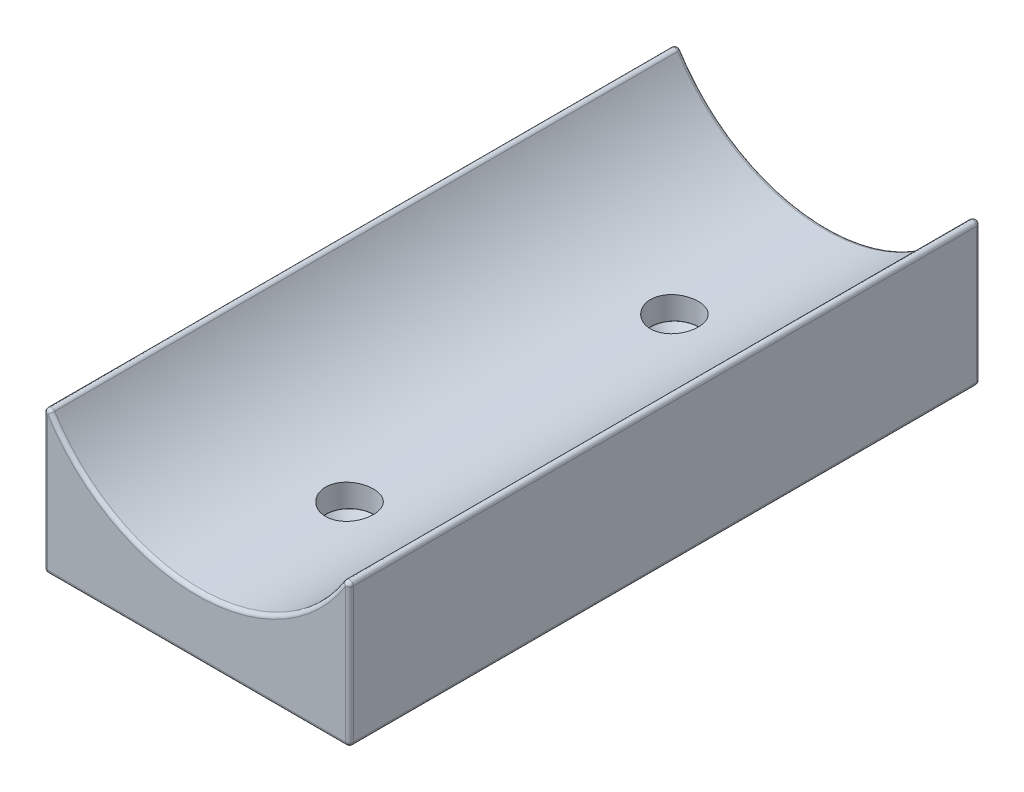
ISO-10303-21;
HEADER;
FILE_DESCRIPTION(('STEP AP214'),'2;1');
FILE_NAME('part.step','',(''),(''),'','','');
FILE_SCHEMA(('AUTOMOTIVE_DESIGN { 1 0 10303 214 1 1 1 1 }'));
ENDSEC;
DATA;
#1=APPLICATION_CONTEXT('core data for automotive mechanical design processes');
#2=APPLICATION_PROTOCOL_DEFINITION('international standard','automotive_design',2000,#1);
#3=PRODUCT_CONTEXT('',#1,'mechanical');
#4=PRODUCT('Part','Part','',(#3));
#5=PRODUCT_RELATED_PRODUCT_CATEGORY('part','',(#4));
#6=PRODUCT_DEFINITION_FORMATION('','',#4);
#7=PRODUCT_DEFINITION_CONTEXT('part definition',#1,'design');
#8=PRODUCT_DEFINITION('design','',#6,#7);
#9=PRODUCT_DEFINITION_SHAPE('','',#8);
#10=(LENGTH_UNIT() NAMED_UNIT(*) SI_UNIT(.MILLI.,.METRE.));
#11=(NAMED_UNIT(*) PLANE_ANGLE_UNIT() SI_UNIT($,.RADIAN.));
#12=(NAMED_UNIT(*) SI_UNIT($,.STERADIAN.) SOLID_ANGLE_UNIT());
#13=UNCERTAINTY_MEASURE_WITH_UNIT(LENGTH_MEASURE(1.E-05),#10,'distance_accuracy_value','');
#14=(GEOMETRIC_REPRESENTATION_CONTEXT(3) GLOBAL_UNCERTAINTY_ASSIGNED_CONTEXT((#13)) GLOBAL_UNIT_ASSIGNED_CONTEXT((#10,
#11,#12)) REPRESENTATION_CONTEXT('',''));
#15=CARTESIAN_POINT('',(0.,0.,0.));
#16=DIRECTION('',(0.,0.,1.));
#17=DIRECTION('',(1.,0.,0.));
#18=AXIS2_PLACEMENT_3D('',#15,#16,#17);
#19=CARTESIAN_POINT('',(20.32,30.861,83.82));
#20=DIRECTION('',(0.,0.,-1.));
#21=DIRECTION('',(-1.,0.,0.));
#22=AXIS2_PLACEMENT_3D('',#19,#20,#21);
#23=CYLINDRICAL_SURFACE('',#22,22.86);
#24=DIRECTION('',(0.,0.,-1.));
#25=VECTOR('',#24,1.);
#26=CARTESIAN_POINT('',(39.7013043478261,18.7389274966309,83.82));
#27=LINE('',#26,#25);
#28=CARTESIAN_POINT('',(39.7013043478261,18.7389274966309,83.312));
#29=VERTEX_POINT('',#28);
#30=CARTESIAN_POINT('',(39.7013043478261,18.7389274966309,0.507999999999995));
#31=VERTEX_POINT('',#30);
#32=EDGE_CURVE('E172',#29,#31,#27,.T.);
#33=ORIENTED_EDGE('',*,*,#32,.T.);
#34=CARTESIAN_POINT('',(20.32,30.861,0.507999999999995));
#35=DIRECTION('',(0.,0.,1.));
#36=DIRECTION('',(1.,0.,0.));
#37=AXIS2_PLACEMENT_3D('',#34,#35,#36);
#38=CIRCLE('',#37,22.86);
#39=CARTESIAN_POINT('',(0.938695652173919,18.7389274966309,0.507999999999995));
#40=VERTEX_POINT('',#39);
#41=EDGE_CURVE('E376',#31,#40,#38,.F.);
#42=ORIENTED_EDGE('',*,*,#41,.T.);
#43=DIRECTION('',(0.,0.,-1.));
#44=VECTOR('',#43,1.);
#45=CARTESIAN_POINT('',(0.938695652173919,18.7389274966309,83.82));
#46=LINE('',#45,#44);
#47=CARTESIAN_POINT('',(0.938695652173919,18.7389274966309,83.312));
#48=VERTEX_POINT('',#47);
#49=EDGE_CURVE('E178',#40,#48,#46,.F.);
#50=ORIENTED_EDGE('',*,*,#49,.T.);
#51=CARTESIAN_POINT('',(20.32,30.861,83.312));
#52=DIRECTION('',(0.,0.,1.));
#53=DIRECTION('',(1.,0.,0.));
#54=AXIS2_PLACEMENT_3D('',#51,#52,#53);
#55=CIRCLE('',#54,22.86);
#56=EDGE_CURVE('E153',#48,#29,#55,.T.);
#57=ORIENTED_EDGE('',*,*,#56,.T.);
#58=EDGE_LOOP('',(#33,#42,#50,#57));
#59=FACE_BOUND('',#58,.T.);
#60=CARTESIAN_POINT('',(20.32,8.001,60.325));
#61=CARTESIAN_POINT('',(20.1425747941006,8.00100268953608,60.3250074259098));
#62=CARTESIAN_POINT('',(19.9650429339173,8.00308732349237,60.339922481686));
#63=CARTESIAN_POINT('',(19.6149311537599,8.01120276633057,60.3991794070121));
#64=CARTESIAN_POINT('',(19.442356400965,8.01723754730456,60.4435508972804));
#65=CARTESIAN_POINT('',(19.1072771624218,8.03257432726405,60.560378039813));
#66=CARTESIAN_POINT('',(18.9447655487206,8.04187398178897,60.6328135435524));
#67=CARTESIAN_POINT('',(18.6342320073907,8.06270978242914,60.8036656254424));
#68=CARTESIAN_POINT('',(18.4862078526872,8.07424558397898,60.9020782016589));
#69=CARTESIAN_POINT('',(18.2078259748383,8.09835538536115,61.1227984753372));
#70=CARTESIAN_POINT('',(18.0775800022721,8.11093521866673,61.24524649486));
#71=CARTESIAN_POINT('',(17.8394150856185,8.13566896522143,61.5102600606394));
#72=CARTESIAN_POINT('',(17.7314973551555,8.14782285528913,61.652826699711));
#73=CARTESIAN_POINT('',(17.54062567205,8.17038548302475,61.9547704146572));
#74=CARTESIAN_POINT('',(17.4577783031403,8.18078668863961,62.1142154782121));
#75=CARTESIAN_POINT('',(17.3200799739782,8.19858773165941,62.444925160577));
#76=CARTESIAN_POINT('',(17.2652277062289,8.20598770923187,62.6161892269622));
#77=CARTESIAN_POINT('',(17.185420366461,8.21689174113152,62.9645066993128));
#78=CARTESIAN_POINT('',(17.1602751070276,8.22042056845701,63.1415157397005));
#79=CARTESIAN_POINT('',(17.1400066949234,8.22325820334618,63.4972735605391));
#80=CARTESIAN_POINT('',(17.1448820603799,8.22256721920746,63.6760222546827));
#81=CARTESIAN_POINT('',(17.1843607594046,8.21706596972832,64.0288503292074));
#82=CARTESIAN_POINT('',(17.2187533619963,8.2122849052783,64.2029538092039));
#83=CARTESIAN_POINT('',(17.3159608839858,8.19918777588387,64.5428943691621));
#84=CARTESIAN_POINT('',(17.3787765017284,8.19087162408376,64.7087312459046));
#85=CARTESIAN_POINT('',(17.5312695276734,8.17160867652345,65.028078550778));
#86=CARTESIAN_POINT('',(17.6210372723077,8.16065305875744,65.1815452880391));
#87=CARTESIAN_POINT('',(17.8248219094465,8.13735216777575,65.4713167625527));
#88=CARTESIAN_POINT('',(17.9388401690861,8.12500681623159,65.6076205315443));
#89=CARTESIAN_POINT('',(18.1890512135839,8.10018806147019,65.8604190927338));
#90=CARTESIAN_POINT('',(18.3254253958391,8.08771446646367,65.976734400518));
#91=CARTESIAN_POINT('',(18.6158559377151,8.06414311288006,66.1848525866876));
#92=CARTESIAN_POINT('',(18.7699123561251,8.05304535887756,66.2766553835713));
#93=CARTESIAN_POINT('',(19.0914818404993,8.03346680801043,66.433147572226));
#94=CARTESIAN_POINT('',(19.2590011315058,8.02498723063021,66.4978243343458));
#95=CARTESIAN_POINT('',(19.602666870342,8.01161099471261,66.5980788230908));
#96=CARTESIAN_POINT('',(19.7788128181881,8.00671412879012,66.6336582340289));
#97=CARTESIAN_POINT('',(20.1331813471256,8.00108228288109,66.6744722061363));
#98=CARTESIAN_POINT('',(20.3113749644631,8.00031342969072,66.6799537496184));
#99=CARTESIAN_POINT('',(20.6661385572871,8.00293238099738,66.6610701915688));
#100=CARTESIAN_POINT('',(20.8427085755579,8.00632007564469,66.6367058788067));
#101=CARTESIAN_POINT('',(21.1884736994443,8.01685048403978,66.5590275227678));
#102=CARTESIAN_POINT('',(21.3576960804246,8.02397774119968,66.5058326142544));
#103=CARTESIAN_POINT('',(21.6848193585933,8.04119013507984,66.3721278794507));
#104=CARTESIAN_POINT('',(21.8427197908676,8.05127539317828,66.2916169322568));
#105=CARTESIAN_POINT('',(22.1438109586694,8.07336576631261,66.104977658936));
#106=CARTESIAN_POINT('',(22.2869028084727,8.08538257053394,65.9986912160543));
#107=CARTESIAN_POINT('',(22.5533055988332,8.10995876277786,65.7637398160434));
#108=CARTESIAN_POINT('',(22.676615560809,8.12251817760364,65.6350737524823));
#109=CARTESIAN_POINT('',(22.9008425473245,8.14687014200974,65.3579212353099));
#110=CARTESIAN_POINT('',(23.0015948521119,8.15865663275617,65.2093009053861));
#111=CARTESIAN_POINT('',(23.1767048659207,8.18002444645374,64.8971015529824));
#112=CARTESIAN_POINT('',(23.2510632052712,8.18960582206456,64.7335228878483));
#113=CARTESIAN_POINT('',(23.3710138915062,8.20543582550541,64.3965601937068));
#114=CARTESIAN_POINT('',(23.4166957984001,8.21169481998703,64.2232085540887));
#115=CARTESIAN_POINT('',(23.4782835881875,8.22019993678631,63.8712012749253));
#116=CARTESIAN_POINT('',(23.4941912109621,8.22244629358491,63.6925459459247));
#117=CARTESIAN_POINT('',(23.4957418852833,8.22266390899993,63.3366429188915));
#118=CARTESIAN_POINT('',(23.4816438123692,8.22067173578499,63.1593963161951));
#119=CARTESIAN_POINT('',(23.4241349864193,8.21271583127374,62.8098194946265));
#120=CARTESIAN_POINT('',(23.3807242551586,8.20675210292773,62.6374892721024));
#121=CARTESIAN_POINT('',(23.2659090773695,8.19153714830777,62.3026913146456));
#122=CARTESIAN_POINT('',(23.1945201268565,8.1822877421042,62.1402181776933));
#123=CARTESIAN_POINT('',(23.0258004736194,8.16154105147753,61.8295141780129));
#124=CARTESIAN_POINT('',(22.9284691478571,8.15004371306932,61.6812836574551));
#125=CARTESIAN_POINT('',(22.709677467455,8.12597812965722,61.4019533242216));
#126=CARTESIAN_POINT('',(22.5880247347735,8.11340183463075,61.2710048750835));
#127=CARTESIAN_POINT('',(22.3244488712294,8.08866440806861,61.0312861847971));
#128=CARTESIAN_POINT('',(22.1825210071528,8.07650337429905,60.9225211367811));
#129=CARTESIAN_POINT('',(21.8816477323371,8.05390234815407,60.7298093490144));
#130=CARTESIAN_POINT('',(21.7226256006919,8.04347069852305,60.6459814497308));
#131=CARTESIAN_POINT('',(21.3926963537488,8.02558655441955,60.506345395131));
#132=CARTESIAN_POINT('',(21.2218020511703,8.0181309050639,60.4505075511631));
#133=CARTESIAN_POINT('',(20.9284036924127,8.00878546287739,60.3814319389698));
#134=CARTESIAN_POINT('',(20.8077299571767,8.00588054583892,60.3603013924478));
#135=CARTESIAN_POINT('',(20.5647210526457,8.0019868962886,60.3320829313859));
#136=CARTESIAN_POINT('',(20.4423858998267,8.00099814478844,60.3249948776914));
#137=CARTESIAN_POINT('',(20.32,8.001,60.325));
#138=B_SPLINE_CURVE_WITH_KNOTS('',3,(#60,#61,#62,#63,#64,#65,#66,#67,#68,#69,#70,#71,#72,#73,
#74,#75,#76,#77,#78,#79,#80,#81,#82,#83,#84,#85,#86,#87,#88,#89,#90,#91,#92,#93,#94,#95,#96,#97,
#98,#99,#100,#101,#102,#103,#104,#105,#106,#107,#108,#109,#110,#111,#112,#113,#114,#115,#116,
#117,#118,#119,#120,#121,#122,#123,#124,#125,#126,#127,#128,#129,#130,#131,#132,#133,#134,#135,
#136,#137),.UNSPECIFIED.,.T.,.F.,(4,2,2,2,2,2,2,2,2,2,2,2,2,2,2,2,2,2,2,2,2,2,2,2,2,2,2,2,2,2,2,
2,2,2,2,2,2,2,4),(0.,0.531828489450308,1.06419258521344,1.59617517697053,2.12807586118937,
2.66317952302756,3.19831226213564,3.73568908761417,4.27304081288614,4.80693338479768,
5.34079960301054,5.87088582304589,6.40098506784442,6.93288128583015,7.46480749768517,
8.00128536683961,8.53776501970691,9.07449417639823,9.61119226208588,10.1434795607122,
10.6757527922935,11.2058431320073,11.7359552264128,12.2694053624824,12.8028818794307,
13.3401353365429,13.8773759623408,14.4129302612793,14.9484532637514,15.4793747546888,
16.0102958512276,16.5409233064515,17.0715635064973,17.6065800314278,18.1417216602855,
18.679374142954,19.2164551321858,19.5833080430183,19.9501573184913),.UNSPECIFIED.);
#139=CARTESIAN_POINT('',(20.32,8.001,60.325));
#140=VERTEX_POINT('',#139);
#141=EDGE_CURVE('E182',#140,#140,#138,.T.);
#142=ORIENTED_EDGE('',*,*,#141,.F.);
#143=EDGE_LOOP('',(#142));
#144=FACE_BOUND('',#143,.T.);
#145=CARTESIAN_POINT('',(20.32,8.001,17.145));
#146=CARTESIAN_POINT('',(20.1425747941006,8.00100268953608,17.1450074259099));
#147=CARTESIAN_POINT('',(19.9650429339173,8.00308732349237,17.159922481686));
#148=CARTESIAN_POINT('',(19.6149311537599,8.01120276633057,17.2191794070121));
#149=CARTESIAN_POINT('',(19.442356400965,8.01723754730456,17.2635508972804));
#150=CARTESIAN_POINT('',(19.1072771624218,8.03257432726405,17.380378039813));
#151=CARTESIAN_POINT('',(18.9447655487206,8.04187398178897,17.4528135435524));
#152=CARTESIAN_POINT('',(18.6342320073907,8.06270978242914,17.6236656254424));
#153=CARTESIAN_POINT('',(18.4862078526872,8.07424558397898,17.7220782016589));
#154=CARTESIAN_POINT('',(18.2078259748383,8.09835538536115,17.9427984753372));
#155=CARTESIAN_POINT('',(18.0775800022721,8.11093521866673,18.06524649486));
#156=CARTESIAN_POINT('',(17.8394150856185,8.13566896522143,18.3302600606394));
#157=CARTESIAN_POINT('',(17.7314973551555,8.14782285528913,18.472826699711));
#158=CARTESIAN_POINT('',(17.54062567205,8.17038548302475,18.7747704146572));
#159=CARTESIAN_POINT('',(17.4577783031403,8.18078668863961,18.9342154782121));
#160=CARTESIAN_POINT('',(17.3200799739782,8.19858773165942,19.264925160577));
#161=CARTESIAN_POINT('',(17.2652277062289,8.20598770923187,19.4361892269622));
#162=CARTESIAN_POINT('',(17.185420366461,8.21689174113151,19.7845066993129));
#163=CARTESIAN_POINT('',(17.1602751070276,8.220420568457,19.9615157397006));
#164=CARTESIAN_POINT('',(17.1400066949234,8.22325820334618,20.3172735605391));
#165=CARTESIAN_POINT('',(17.1448820603799,8.22256721920746,20.4960222546827));
#166=CARTESIAN_POINT('',(17.1843607594046,8.21706596972833,20.8488503292074));
#167=CARTESIAN_POINT('',(17.2187533619963,8.2122849052783,21.0229538092039));
#168=CARTESIAN_POINT('',(17.3159608839858,8.19918777588387,21.3628943691621));
#169=CARTESIAN_POINT('',(17.3787765017284,8.19087162408376,21.5287312459047));
#170=CARTESIAN_POINT('',(17.5312695276734,8.17160867652345,21.8480785507781));
#171=CARTESIAN_POINT('',(17.6210372723077,8.16065305875745,22.0015452880391));
#172=CARTESIAN_POINT('',(17.8248219094465,8.13735216777574,22.2913167625528));
#173=CARTESIAN_POINT('',(17.9388401690861,8.12500681623158,22.4276205315443));
#174=CARTESIAN_POINT('',(18.1890512135838,8.10018806147019,22.6804190927338));
#175=CARTESIAN_POINT('',(18.3254253958391,8.08771446646367,22.796734400518));
#176=CARTESIAN_POINT('',(18.6158559377151,8.06414311288006,23.0048525866876));
#177=CARTESIAN_POINT('',(18.7699123561251,8.05304535887756,23.0966553835713));
#178=CARTESIAN_POINT('',(19.0914818404993,8.03346680801043,23.253147572226));
#179=CARTESIAN_POINT('',(19.2590011315058,8.02498723063021,23.3178243343458));
#180=CARTESIAN_POINT('',(19.602666870342,8.01161099471261,23.4180788230908));
#181=CARTESIAN_POINT('',(19.7788128181881,8.00671412879013,23.453658234029));
#182=CARTESIAN_POINT('',(20.1331813471256,8.00108228288109,23.4944722061363));
#183=CARTESIAN_POINT('',(20.3113749644631,8.00031342969072,23.4999537496184));
#184=CARTESIAN_POINT('',(20.6661385572871,8.00293238099737,23.4810701915688));
#185=CARTESIAN_POINT('',(20.8427085755579,8.0063200756447,23.4567058788067));
#186=CARTESIAN_POINT('',(21.1884736994443,8.01685048403979,23.3790275227678));
#187=CARTESIAN_POINT('',(21.3576960804246,8.02397774119967,23.3258326142544));
#188=CARTESIAN_POINT('',(21.6848193585933,8.04119013507984,23.1921278794507));
#189=CARTESIAN_POINT('',(21.8427197908676,8.05127539317828,23.1116169322568));
#190=CARTESIAN_POINT('',(22.1438109586694,8.07336576631261,22.924977658936));
#191=CARTESIAN_POINT('',(22.2869028084727,8.08538257053394,22.8186912160544));
#192=CARTESIAN_POINT('',(22.5533055988332,8.10995876277786,22.5837398160434));
#193=CARTESIAN_POINT('',(22.676615560809,8.12251817760364,22.4550737524823));
#194=CARTESIAN_POINT('',(22.9008425473245,8.14687014200973,22.17792123531));
#195=CARTESIAN_POINT('',(23.0015948521119,8.15865663275616,22.0293009053861));
#196=CARTESIAN_POINT('',(23.1767048659207,8.18002444645375,21.7171015529824));
#197=CARTESIAN_POINT('',(23.2510632052712,8.18960582206457,21.5535228878483));
#198=CARTESIAN_POINT('',(23.3710138915062,8.20543582550541,21.2165601937068));
#199=CARTESIAN_POINT('',(23.4166957984001,8.21169481998703,21.0432085540887));
#200=CARTESIAN_POINT('',(23.4782835881875,8.22019993678631,20.6912012749253));
#201=CARTESIAN_POINT('',(23.4941912109621,8.22244629358491,20.5125459459247));
#202=CARTESIAN_POINT('',(23.4957418852833,8.22266390899993,20.1566429188915));
#203=CARTESIAN_POINT('',(23.4816438123692,8.22067173578499,19.9793963161951));
#204=CARTESIAN_POINT('',(23.4241349864193,8.21271583127374,19.6298194946265));
#205=CARTESIAN_POINT('',(23.3807242551586,8.20675210292773,19.4574892721024));
#206=CARTESIAN_POINT('',(23.2659090773695,8.19153714830777,19.1226913146456));
#207=CARTESIAN_POINT('',(23.1945201268565,8.1822877421042,18.9602181776933));
#208=CARTESIAN_POINT('',(23.0258004736194,8.16154105147753,18.6495141780129));
#209=CARTESIAN_POINT('',(22.9284691478571,8.15004371306932,18.5012836574551));
#210=CARTESIAN_POINT('',(22.709677467455,8.12597812965722,18.2219533242216));
#211=CARTESIAN_POINT('',(22.5880247347735,8.11340183463075,18.0910048750835));
#212=CARTESIAN_POINT('',(22.3244488712294,8.08866440806861,17.8512861847971));
#213=CARTESIAN_POINT('',(22.1825210071528,8.07650337429905,17.7425211367811));
#214=CARTESIAN_POINT('',(21.8816477323371,8.05390234815407,17.5498093490144));
#215=CARTESIAN_POINT('',(21.7226256006919,8.04347069852305,17.4659814497308));
#216=CARTESIAN_POINT('',(21.3926963537488,8.02558655441955,17.326345395131));
#217=CARTESIAN_POINT('',(21.2218020511703,8.0181309050639,17.2705075511631));
#218=CARTESIAN_POINT('',(20.9284036924127,8.00878546287739,17.2014319389698));
#219=CARTESIAN_POINT('',(20.8077299571767,8.00588054583892,17.1803013924478));
#220=CARTESIAN_POINT('',(20.5647210526457,8.0019868962886,17.1520829313859));
#221=CARTESIAN_POINT('',(20.4423858998267,8.00099814478844,17.1449948776914));
#222=CARTESIAN_POINT('',(20.32,8.001,17.145));
#223=B_SPLINE_CURVE_WITH_KNOTS('',3,(#145,#146,#147,#148,#149,#150,#151,#152,#153,#154,#155,
#156,#157,#158,#159,#160,#161,#162,#163,#164,#165,#166,#167,#168,#169,#170,#171,#172,#173,#174,
#175,#176,#177,#178,#179,#180,#181,#182,#183,#184,#185,#186,#187,#188,#189,#190,#191,#192,#193,
#194,#195,#196,#197,#198,#199,#200,#201,#202,#203,#204,#205,#206,#207,#208,#209,#210,#211,#212,
#213,#214,#215,#216,#217,#218,#219,#220,#221,#222),.UNSPECIFIED.,.T.,.F.,(4,2,2,2,2,2,2,2,2,2,2,
2,2,2,2,2,2,2,2,2,2,2,2,2,2,2,2,2,2,2,2,2,2,2,2,2,2,2,4),(0.,0.531828489450308,1.06419258521344,
1.59617517697053,2.12807586118937,2.66317952302755,3.19831226213564,3.73568908761417,
4.27304081288614,4.80693338479769,5.34079960301054,5.8708858230459,6.40098506784443,
6.93288128583015,7.46480749768518,8.00128536683961,8.53776501970692,9.07449417639824,
9.61119226208589,10.1434795607122,10.6757527922936,11.2058431320073,11.7359552264128,
12.2694053624825,12.8028818794307,13.3401353365429,13.8773759623408,14.4129302612794,
14.9484532637515,15.4793747546889,16.0102958512276,16.5409233064515,17.0715635064973,
17.6065800314278,18.1417216602855,18.679374142954,19.2164551321859,19.5833080430183,
19.9501573184913),.UNSPECIFIED.);
#224=CARTESIAN_POINT('',(20.32,8.001,17.145));
#225=VERTEX_POINT('',#224);
#226=EDGE_CURVE('E191',#225,#225,#223,.T.);
#227=ORIENTED_EDGE('',*,*,#226,.F.);
#228=EDGE_LOOP('',(#227));
#229=FACE_BOUND('',#228,.T.);
#230=ADVANCED_FACE('F41',(#59,#144,#229),#23,.F.);
#231=CARTESIAN_POINT('',(0.,0.,83.82));
#232=DIRECTION('',(1.,0.,0.));
#233=DIRECTION('',(0.,0.,-1.));
#234=AXIS2_PLACEMENT_3D('',#231,#232,#233);
#235=PLANE('',#234);
#236=DIRECTION('',(0.,0.,-1.));
#237=VECTOR('',#236,1.);
#238=CARTESIAN_POINT('',(0.,0.508,83.82));
#239=LINE('',#238,#237);
#240=CARTESIAN_POINT('',(0.,0.508,0.507999999999995));
#241=VERTEX_POINT('',#240);
#242=CARTESIAN_POINT('',(0.,0.508,83.312));
#243=VERTEX_POINT('',#242);
#244=EDGE_CURVE('E354',#241,#243,#239,.F.);
#245=ORIENTED_EDGE('',*,*,#244,.T.);
#246=DIRECTION('',(0.,-1.,0.));
#247=VECTOR('',#246,1.);
#248=CARTESIAN_POINT('',(0.,18.4695481076671,83.312));
#249=LINE('',#248,#247);
#250=CARTESIAN_POINT('',(0.,18.4695481076671,83.312));
#251=VERTEX_POINT('',#250);
#252=EDGE_CURVE('E348',#243,#251,#249,.F.);
#253=ORIENTED_EDGE('',*,*,#252,.T.);
#254=DIRECTION('',(0.,0.,-1.));
#255=VECTOR('',#254,1.);
#256=CARTESIAN_POINT('',(0.,18.4695481076671,83.82));
#257=LINE('',#256,#255);
#258=CARTESIAN_POINT('',(0.,18.4695481076671,0.507999999999995));
#259=VERTEX_POINT('',#258);
#260=EDGE_CURVE('E171',#251,#259,#257,.T.);
#261=ORIENTED_EDGE('',*,*,#260,.T.);
#262=DIRECTION('',(0.,-1.,0.));
#263=VECTOR('',#262,1.);
#264=CARTESIAN_POINT('',(0.,0.,0.507999999999995));
#265=LINE('',#264,#263);
#266=EDGE_CURVE('E351',#259,#241,#265,.T.);
#267=ORIENTED_EDGE('',*,*,#266,.T.);
#268=EDGE_LOOP('',(#245,#253,#261,#267));
#269=FACE_BOUND('',#268,.T.);
#270=ADVANCED_FACE('F220',(#269),#235,.F.);
#271=CARTESIAN_POINT('',(0.,0.,83.82));
#272=DIRECTION('',(0.,1.,0.));
#273=DIRECTION('',(0.,0.,1.));
#274=AXIS2_PLACEMENT_3D('',#271,#272,#273);
#275=PLANE('',#274);
#276=DIRECTION('',(0.,0.,-1.));
#277=VECTOR('',#276,1.);
#278=CARTESIAN_POINT('',(0.508,0.,83.82));
#279=LINE('',#278,#277);
#280=CARTESIAN_POINT('',(0.508,0.,83.312));
#281=VERTEX_POINT('',#280);
#282=CARTESIAN_POINT('',(0.508,0.,0.507999999999995));
#283=VERTEX_POINT('',#282);
#284=EDGE_CURVE('E51',#281,#283,#279,.T.);
#285=ORIENTED_EDGE('',*,*,#284,.T.);
#286=DIRECTION('',(1.,0.,0.));
#287=VECTOR('',#286,1.);
#288=CARTESIAN_POINT('',(0.,0.,0.507999999999995));
#289=LINE('',#288,#287);
#290=CARTESIAN_POINT('',(40.132,0.,0.507999999999995));
#291=VERTEX_POINT('',#290);
#292=EDGE_CURVE('E11',#283,#291,#289,.T.);
#293=ORIENTED_EDGE('',*,*,#292,.T.);
#294=DIRECTION('',(0.,0.,-1.));
#295=VECTOR('',#294,1.);
#296=CARTESIAN_POINT('',(40.132,0.,83.82));
#297=LINE('',#296,#295);
#298=CARTESIAN_POINT('',(40.132,0.,83.312));
#299=VERTEX_POINT('',#298);
#300=EDGE_CURVE('E345',#291,#299,#297,.F.);
#301=ORIENTED_EDGE('',*,*,#300,.T.);
#302=DIRECTION('',(1.,0.,0.));
#303=VECTOR('',#302,1.);
#304=CARTESIAN_POINT('',(0.,0.,83.312));
#305=LINE('',#304,#303);
#306=EDGE_CURVE('E62',#299,#281,#305,.F.);
#307=ORIENTED_EDGE('',*,*,#306,.T.);
#308=EDGE_LOOP('',(#285,#293,#301,#307));
#309=FACE_BOUND('',#308,.T.);
#310=CARTESIAN_POINT('',(20.32,0.,20.32));
#311=DIRECTION('',(0.,1.,0.));
#312=DIRECTION('',(0.,0.,1.));
#313=AXIS2_PLACEMENT_3D('',#310,#311,#312);
#314=CIRCLE('',#313,1.79999999999992);
#315=CARTESIAN_POINT('',(20.32,0.,22.1199999999999));
#316=VERTEX_POINT('',#315);
#317=EDGE_CURVE('E257',#316,#316,#314,.T.);
#318=ORIENTED_EDGE('',*,*,#317,.T.);
#319=EDGE_LOOP('',(#318));
#320=FACE_BOUND('',#319,.T.);
#321=CARTESIAN_POINT('',(20.32,0.,63.5));
#322=DIRECTION('',(0.,1.,0.));
#323=DIRECTION('',(0.,0.,1.));
#324=AXIS2_PLACEMENT_3D('',#321,#322,#323);
#325=CIRCLE('',#324,1.79999999999992);
#326=CARTESIAN_POINT('',(20.32,0.,65.2999999999999));
#327=VERTEX_POINT('',#326);
#328=EDGE_CURVE('E245',#327,#327,#325,.T.);
#329=ORIENTED_EDGE('',*,*,#328,.T.);
#330=EDGE_LOOP('',(#329));
#331=FACE_BOUND('',#330,.T.);
#332=ADVANCED_FACE('F225',(#309,#320,#331),#275,.F.);
#333=CARTESIAN_POINT('',(40.64,0.,83.82));
#334=DIRECTION('',(-1.,0.,0.));
#335=DIRECTION('',(0.,0.,1.));
#336=AXIS2_PLACEMENT_3D('',#333,#334,#335);
#337=PLANE('',#336);
#338=DIRECTION('',(0.,0.,-1.));
#339=VECTOR('',#338,1.);
#340=CARTESIAN_POINT('',(40.64,0.508,83.82));
#341=LINE('',#340,#339);
#342=CARTESIAN_POINT('',(40.64,0.508,83.312));
#343=VERTEX_POINT('',#342);
#344=CARTESIAN_POINT('',(40.64,0.508,0.507999999999995));
#345=VERTEX_POINT('',#344);
#346=EDGE_CURVE('E162',#343,#345,#341,.T.);
#347=ORIENTED_EDGE('',*,*,#346,.T.);
#348=DIRECTION('',(0.,1.,0.));
#349=VECTOR('',#348,1.);
#350=CARTESIAN_POINT('',(40.64,0.,0.507999999999995));
#351=LINE('',#350,#349);
#352=CARTESIAN_POINT('',(40.64,18.4695481076671,0.507999999999995));
#353=VERTEX_POINT('',#352);
#354=EDGE_CURVE('E136',#345,#353,#351,.T.);
#355=ORIENTED_EDGE('',*,*,#354,.T.);
#356=DIRECTION('',(0.,0.,-1.));
#357=VECTOR('',#356,1.);
#358=CARTESIAN_POINT('',(40.64,18.4695481076671,83.82));
#359=LINE('',#358,#357);
#360=CARTESIAN_POINT('',(40.64,18.4695481076671,83.312));
#361=VERTEX_POINT('',#360);
#362=EDGE_CURVE('E159',#353,#361,#359,.F.);
#363=ORIENTED_EDGE('',*,*,#362,.T.);
#364=DIRECTION('',(0.,1.,0.));
#365=VECTOR('',#364,1.);
#366=CARTESIAN_POINT('',(40.64,0.,83.312));
#367=LINE('',#366,#365);
#368=EDGE_CURVE('E166',#361,#343,#367,.F.);
#369=ORIENTED_EDGE('',*,*,#368,.T.);
#370=EDGE_LOOP('',(#347,#355,#363,#369));
#371=FACE_BOUND('',#370,.T.);
#372=ADVANCED_FACE('F158',(#371),#337,.F.);
#373=CARTESIAN_POINT('',(20.32,30.861,83.82));
#374=DIRECTION('',(0.,0.,1.));
#375=DIRECTION('',(1.,0.,0.));
#376=AXIS2_PLACEMENT_3D('',#373,#374,#375);
#377=PLANE('',#376);
#378=DIRECTION('',(0.,-1.,0.));
#379=VECTOR('',#378,1.);
#380=CARTESIAN_POINT('',(0.508000000000002,0.,83.82));
#381=LINE('',#380,#379);
#382=CARTESIAN_POINT('',(0.508000000000002,18.4695481076671,83.82));
#383=VERTEX_POINT('',#382);
#384=CARTESIAN_POINT('',(0.508000000000002,0.508000000000002,83.82));
#385=VERTEX_POINT('',#384);
#386=EDGE_CURVE('E364',#383,#385,#381,.T.);
#387=ORIENTED_EDGE('',*,*,#386,.T.);
#388=DIRECTION('',(1.,0.,0.));
#389=VECTOR('',#388,1.);
#390=CARTESIAN_POINT('',(40.64,0.508000000000002,83.82));
#391=LINE('',#390,#389);
#392=CARTESIAN_POINT('',(40.132,0.508000000000002,83.82));
#393=VERTEX_POINT('',#392);
#394=EDGE_CURVE('E357',#385,#393,#391,.T.);
#395=ORIENTED_EDGE('',*,*,#394,.T.);
#396=DIRECTION('',(0.,1.,0.));
#397=VECTOR('',#396,1.);
#398=CARTESIAN_POINT('',(40.132,18.4695481076671,83.82));
#399=LINE('',#398,#397);
#400=CARTESIAN_POINT('',(40.132,18.4695481076671,83.82));
#401=VERTEX_POINT('',#400);
#402=EDGE_CURVE('E360',#393,#401,#399,.T.);
#403=ORIENTED_EDGE('',*,*,#402,.T.);
#404=CARTESIAN_POINT('',(20.32,30.861,83.82));
#405=DIRECTION('',(0.,0.,1.));
#406=DIRECTION('',(1.,0.,0.));
#407=AXIS2_PLACEMENT_3D('',#404,#405,#406);
#408=CIRCLE('',#407,23.368);
#409=EDGE_CURVE('E367',#401,#383,#408,.F.);
#410=ORIENTED_EDGE('',*,*,#409,.T.);
#411=EDGE_LOOP('',(#387,#395,#403,#410));
#412=FACE_BOUND('',#411,.T.);
#413=ADVANCED_FACE('F209',(#412),#377,.T.);
#414=CARTESIAN_POINT('',(20.32,30.861,0.));
#415=DIRECTION('',(0.,0.,1.));
#416=DIRECTION('',(1.,0.,0.));
#417=AXIS2_PLACEMENT_3D('',#414,#415,#416);
#418=PLANE('',#417);
#419=CARTESIAN_POINT('',(20.32,30.861,0.));
#420=DIRECTION('',(0.,0.,1.));
#421=DIRECTION('',(1.,0.,0.));
#422=AXIS2_PLACEMENT_3D('',#419,#420,#421);
#423=CIRCLE('',#422,23.368);
#424=CARTESIAN_POINT('',(0.508,18.4695481076671,0.));
#425=VERTEX_POINT('',#424);
#426=CARTESIAN_POINT('',(40.132,18.4695481076671,0.));
#427=VERTEX_POINT('',#426);
#428=EDGE_CURVE('E385',#425,#427,#423,.T.);
#429=ORIENTED_EDGE('',*,*,#428,.T.);
#430=DIRECTION('',(0.,1.,0.));
#431=VECTOR('',#430,1.);
#432=CARTESIAN_POINT('',(40.132,30.861,0.));
#433=LINE('',#432,#431);
#434=CARTESIAN_POINT('',(40.132,0.508,0.));
#435=VERTEX_POINT('',#434);
#436=EDGE_CURVE('E138',#427,#435,#433,.F.);
#437=ORIENTED_EDGE('',*,*,#436,.T.);
#438=DIRECTION('',(1.,0.,0.));
#439=VECTOR('',#438,1.);
#440=CARTESIAN_POINT('',(20.32,0.508000000000002,0.));
#441=LINE('',#440,#439);
#442=CARTESIAN_POINT('',(0.508,0.508,0.));
#443=VERTEX_POINT('',#442);
#444=EDGE_CURVE('E388',#435,#443,#441,.F.);
#445=ORIENTED_EDGE('',*,*,#444,.T.);
#446=DIRECTION('',(0.,-1.,0.));
#447=VECTOR('',#446,1.);
#448=CARTESIAN_POINT('',(0.508000000000002,30.861,0.));
#449=LINE('',#448,#447);
#450=EDGE_CURVE('E165',#443,#425,#449,.F.);
#451=ORIENTED_EDGE('',*,*,#450,.T.);
#452=EDGE_LOOP('',(#429,#437,#445,#451));
#453=FACE_BOUND('',#452,.T.);
#454=ADVANCED_FACE('F211',(#453),#418,.F.);
#455=CARTESIAN_POINT('',(40.132,18.4695481076671,83.82));
#456=DIRECTION('',(0.,0.,-1.));
#457=DIRECTION('',(-1.,0.,0.));
#458=AXIS2_PLACEMENT_3D('',#455,#456,#457);
#459=CYLINDRICAL_SURFACE('',#458,0.508);
#460=ORIENTED_EDGE('',*,*,#362,.F.);
#461=CARTESIAN_POINT('',(40.132,18.4695481076671,0.507999999999995));
#462=DIRECTION('',(0.,0.,-1.));
#463=DIRECTION('',(-1.,0.,0.));
#464=AXIS2_PLACEMENT_3D('',#461,#462,#463);
#465=CIRCLE('',#464,0.508);
#466=EDGE_CURVE('E144',#353,#31,#465,.F.);
#467=ORIENTED_EDGE('',*,*,#466,.T.);
#468=ORIENTED_EDGE('',*,*,#32,.F.);
#469=CARTESIAN_POINT('',(40.132,18.4695481076671,83.312));
#470=DIRECTION('',(0.,0.,-1.));
#471=DIRECTION('',(-1.,0.,0.));
#472=AXIS2_PLACEMENT_3D('',#469,#470,#471);
#473=CIRCLE('',#472,0.508);
#474=EDGE_CURVE('E154',#29,#361,#473,.T.);
#475=ORIENTED_EDGE('',*,*,#474,.T.);
#476=EDGE_LOOP('',(#460,#467,#468,#475));
#477=FACE_BOUND('',#476,.T.);
#478=ADVANCED_FACE('F168',(#477),#459,.T.);
#479=CARTESIAN_POINT('',(0.508000000000002,18.4695481076671,83.82));
#480=DIRECTION('',(0.,0.,-1.));
#481=DIRECTION('',(-1.,0.,0.));
#482=AXIS2_PLACEMENT_3D('',#479,#480,#481);
#483=CYLINDRICAL_SURFACE('',#482,0.508);
#484=ORIENTED_EDGE('',*,*,#49,.F.);
#485=CARTESIAN_POINT('',(0.508000000000002,18.4695481076671,0.507999999999995));
#486=DIRECTION('',(0.,0.,-1.));
#487=DIRECTION('',(-1.,0.,0.));
#488=AXIS2_PLACEMENT_3D('',#485,#486,#487);
#489=CIRCLE('',#488,0.508);
#490=EDGE_CURVE('E370',#40,#259,#489,.F.);
#491=ORIENTED_EDGE('',*,*,#490,.T.);
#492=ORIENTED_EDGE('',*,*,#260,.F.);
#493=CARTESIAN_POINT('',(0.508000000000002,18.4695481076671,83.312));
#494=DIRECTION('',(0.,0.,-1.));
#495=DIRECTION('',(-1.,0.,0.));
#496=AXIS2_PLACEMENT_3D('',#493,#494,#495);
#497=CIRCLE('',#496,0.508);
#498=EDGE_CURVE('E373',#251,#48,#497,.T.);
#499=ORIENTED_EDGE('',*,*,#498,.T.);
#500=EDGE_LOOP('',(#484,#491,#492,#499));
#501=FACE_BOUND('',#500,.T.);
#502=ADVANCED_FACE('F207',(#501),#483,.T.);
#503=CARTESIAN_POINT('',(20.32,18.9775481076671,63.5));
#504=DIRECTION('',(0.,-1.,0.));
#505=DIRECTION('',(0.,0.,-1.));
#506=AXIS2_PLACEMENT_3D('',#503,#504,#505);
#507=CYLINDRICAL_SURFACE('',#506,3.175);
#508=CARTESIAN_POINT('',(20.32,5.08,63.5));
#509=DIRECTION('',(0.,1.,0.));
#510=DIRECTION('',(0.,0.,1.));
#511=AXIS2_PLACEMENT_3D('',#508,#509,#510);
#512=CIRCLE('',#511,3.175);
#513=CARTESIAN_POINT('',(20.32,5.08,66.675));
#514=VERTEX_POINT('',#513);
#515=EDGE_CURVE('E241',#514,#514,#512,.T.);
#516=ORIENTED_EDGE('',*,*,#515,.F.);
#517=EDGE_LOOP('',(#516));
#518=FACE_BOUND('',#517,.T.);
#519=ORIENTED_EDGE('',*,*,#141,.T.);
#520=EDGE_LOOP('',(#519));
#521=FACE_BOUND('',#520,.T.);
#522=ADVANCED_FACE('F201',(#518,#521),#507,.F.);
#523=CARTESIAN_POINT('',(20.32,5.08,63.5));
#524=DIRECTION('',(0.,1.,0.));
#525=DIRECTION('',(0.,0.,1.));
#526=AXIS2_PLACEMENT_3D('',#523,#524,#525);
#527=PLANE('',#526);
#528=CARTESIAN_POINT('',(20.32,5.08,63.5));
#529=DIRECTION('',(0.,1.,0.));
#530=DIRECTION('',(0.,0.,1.));
#531=AXIS2_PLACEMENT_3D('',#528,#529,#530);
#532=CIRCLE('',#531,3.15);
#533=CARTESIAN_POINT('',(20.32,5.08,66.65));
#534=VERTEX_POINT('',#533);
#535=EDGE_CURVE('E253',#534,#534,#532,.T.);
#536=ORIENTED_EDGE('',*,*,#535,.F.);
#537=EDGE_LOOP('',(#536));
#538=FACE_BOUND('',#537,.T.);
#539=ORIENTED_EDGE('',*,*,#515,.T.);
#540=EDGE_LOOP('',(#539));
#541=FACE_BOUND('',#540,.T.);
#542=ADVANCED_FACE('F206',(#538,#541),#527,.T.);
#543=CARTESIAN_POINT('',(20.32,18.9775481076671,20.32));
#544=DIRECTION('',(0.,-1.,0.));
#545=DIRECTION('',(0.,0.,-1.));
#546=AXIS2_PLACEMENT_3D('',#543,#544,#545);
#547=CYLINDRICAL_SURFACE('',#546,3.175);
#548=CARTESIAN_POINT('',(20.32,5.08,20.32));
#549=DIRECTION('',(0.,1.,0.));
#550=DIRECTION('',(0.,0.,1.));
#551=AXIS2_PLACEMENT_3D('',#548,#549,#550);
#552=CIRCLE('',#551,3.175);
#553=CARTESIAN_POINT('',(20.32,5.08,23.495));
#554=VERTEX_POINT('',#553);
#555=EDGE_CURVE('E192',#554,#554,#552,.T.);
#556=ORIENTED_EDGE('',*,*,#555,.F.);
#557=EDGE_LOOP('',(#556));
#558=FACE_BOUND('',#557,.T.);
#559=ORIENTED_EDGE('',*,*,#226,.T.);
#560=EDGE_LOOP('',(#559));
#561=FACE_BOUND('',#560,.T.);
#562=ADVANCED_FACE('F417',(#558,#561),#547,.F.);
#563=CARTESIAN_POINT('',(20.32,5.08,20.32));
#564=DIRECTION('',(0.,1.,0.));
#565=DIRECTION('',(0.,0.,1.));
#566=AXIS2_PLACEMENT_3D('',#563,#564,#565);
#567=PLANE('',#566);
#568=CARTESIAN_POINT('',(20.32,5.08,20.32));
#569=DIRECTION('',(0.,1.,0.));
#570=DIRECTION('',(0.,0.,1.));
#571=AXIS2_PLACEMENT_3D('',#568,#569,#570);
#572=CIRCLE('',#571,3.15);
#573=CARTESIAN_POINT('',(20.32,5.08,23.47));
#574=VERTEX_POINT('',#573);
#575=EDGE_CURVE('E262',#574,#574,#572,.T.);
#576=ORIENTED_EDGE('',*,*,#575,.F.);
#577=EDGE_LOOP('',(#576));
#578=FACE_BOUND('',#577,.T.);
#579=ORIENTED_EDGE('',*,*,#555,.T.);
#580=EDGE_LOOP('',(#579));
#581=FACE_BOUND('',#580,.T.);
#582=ADVANCED_FACE('F407',(#578,#581),#567,.T.);
#583=CARTESIAN_POINT('',(20.32,5.08,63.5));
#584=DIRECTION('',(0.,1.,0.));
#585=DIRECTION('',(0.,0.,1.));
#586=AXIS2_PLACEMENT_3D('',#583,#584,#585);
#587=CYLINDRICAL_SURFACE('',#586,1.79999999999992);
#588=CARTESIAN_POINT('',(20.32,3.72999999999993,63.5));
#589=DIRECTION('',(0.,1.,0.));
#590=DIRECTION('',(0.,0.,1.));
#591=AXIS2_PLACEMENT_3D('',#588,#589,#590);
#592=CIRCLE('',#591,1.79999999999995);
#593=CARTESIAN_POINT('',(20.32,3.72999999999993,65.2999999999999));
#594=VERTEX_POINT('',#593);
#595=EDGE_CURVE('E249',#594,#594,#592,.T.);
#596=ORIENTED_EDGE('',*,*,#595,.T.);
#597=EDGE_LOOP('',(#596));
#598=FACE_BOUND('',#597,.T.);
#599=ORIENTED_EDGE('',*,*,#328,.F.);
#600=EDGE_LOOP('',(#599));
#601=FACE_BOUND('',#600,.T.);
#602=ADVANCED_FACE('F404',(#598,#601),#587,.F.);
#603=CARTESIAN_POINT('',(20.32,5.08,63.5));
#604=DIRECTION('',(0.,1.,0.));
#605=DIRECTION('',(0.,0.,1.));
#606=AXIS2_PLACEMENT_3D('',#603,#604,#605);
#607=CONICAL_SURFACE('',#606,3.15,0.785398163397441);
#608=ORIENTED_EDGE('',*,*,#595,.F.);
#609=EDGE_LOOP('',(#608));
#610=FACE_BOUND('',#609,.T.);
#611=ORIENTED_EDGE('',*,*,#535,.T.);
#612=EDGE_LOOP('',(#611));
#613=FACE_BOUND('',#612,.T.);
#614=ADVANCED_FACE('F406',(#610,#613),#607,.F.);
#615=CARTESIAN_POINT('',(20.32,5.08,20.32));
#616=DIRECTION('',(0.,1.,0.));
#617=DIRECTION('',(0.,0.,1.));
#618=AXIS2_PLACEMENT_3D('',#615,#616,#617);
#619=CYLINDRICAL_SURFACE('',#618,1.79999999999992);
#620=CARTESIAN_POINT('',(20.32,3.72999999999993,20.32));
#621=DIRECTION('',(0.,1.,0.));
#622=DIRECTION('',(0.,0.,1.));
#623=AXIS2_PLACEMENT_3D('',#620,#621,#622);
#624=CIRCLE('',#623,1.79999999999995);
#625=CARTESIAN_POINT('',(20.32,3.72999999999993,22.12));
#626=VERTEX_POINT('',#625);
#627=EDGE_CURVE('E258',#626,#626,#624,.T.);
#628=ORIENTED_EDGE('',*,*,#627,.T.);
#629=EDGE_LOOP('',(#628));
#630=FACE_BOUND('',#629,.T.);
#631=ORIENTED_EDGE('',*,*,#317,.F.);
#632=EDGE_LOOP('',(#631));
#633=FACE_BOUND('',#632,.T.);
#634=ADVANCED_FACE('F414',(#630,#633),#619,.F.);
#635=CARTESIAN_POINT('',(20.32,5.08,20.32));
#636=DIRECTION('',(0.,1.,0.));
#637=DIRECTION('',(0.,0.,1.));
#638=AXIS2_PLACEMENT_3D('',#635,#636,#637);
#639=CONICAL_SURFACE('',#638,3.15,0.785398163397441);
#640=ORIENTED_EDGE('',*,*,#627,.F.);
#641=EDGE_LOOP('',(#640));
#642=FACE_BOUND('',#641,.T.);
#643=ORIENTED_EDGE('',*,*,#575,.T.);
#644=EDGE_LOOP('',(#643));
#645=FACE_BOUND('',#644,.T.);
#646=ADVANCED_FACE('F494',(#642,#645),#639,.F.);
#647=CARTESIAN_POINT('',(0.508000000000002,18.4695481076671,83.312));
#648=DIRECTION('',(0.,0.,1.));
#649=DIRECTION('',(1.,0.,0.));
#650=AXIS2_PLACEMENT_3D('',#647,#648,#649);
#651=SPHERICAL_SURFACE('',#650,0.508);
#652=CARTESIAN_POINT('',(0.508000000000002,18.4695481076671,83.312));
#653=DIRECTION('',(0.530274387723931,-0.847826086956523,0.));
#654=DIRECTION('',(0.847826086956523,0.530274387723931,0.));
#655=AXIS2_PLACEMENT_3D('',#652,#653,#654);
#656=CIRCLE('',#655,0.508);
#657=EDGE_CURVE('E269',#48,#383,#656,.T.);
#658=ORIENTED_EDGE('',*,*,#657,.F.);
#659=ORIENTED_EDGE('',*,*,#498,.F.);
#660=CARTESIAN_POINT('',(0.508000000000002,18.4695481076671,83.312));
#661=DIRECTION('',(0.,-1.,0.));
#662=DIRECTION('',(0.,0.,-1.));
#663=AXIS2_PLACEMENT_3D('',#660,#661,#662);
#664=CIRCLE('',#663,0.508);
#665=EDGE_CURVE('E45',#383,#251,#664,.T.);
#666=ORIENTED_EDGE('',*,*,#665,.F.);
#667=EDGE_LOOP('',(#658,#659,#666));
#668=FACE_BOUND('',#667,.T.);
#669=ADVANCED_FACE('F43',(#668),#651,.T.);
#670=CARTESIAN_POINT('',(0.508000000000002,30.861,83.312));
#671=DIRECTION('',(0.,1.,0.));
#672=DIRECTION('',(0.,0.,1.));
#673=AXIS2_PLACEMENT_3D('',#670,#671,#672);
#674=CYLINDRICAL_SURFACE('',#673,0.508);
#675=ORIENTED_EDGE('',*,*,#665,.T.);
#676=ORIENTED_EDGE('',*,*,#252,.F.);
#677=CARTESIAN_POINT('',(0.508000000000002,0.508000000000002,83.312));
#678=DIRECTION('',(0.,-1.,0.));
#679=DIRECTION('',(1.,0.,0.));
#680=AXIS2_PLACEMENT_3D('',#677,#678,#679);
#681=CIRCLE('',#680,0.508);
#682=EDGE_CURVE('E276',#385,#243,#681,.T.);
#683=ORIENTED_EDGE('',*,*,#682,.F.);
#684=ORIENTED_EDGE('',*,*,#386,.F.);
#685=EDGE_LOOP('',(#675,#676,#683,#684));
#686=FACE_BOUND('',#685,.T.);
#687=ADVANCED_FACE('F542',(#686),#674,.T.);
#688=CARTESIAN_POINT('',(20.32,30.861,83.312));
#689=DIRECTION('',(0.,0.,1.));
#690=DIRECTION('',(1.,0.,0.));
#691=AXIS2_PLACEMENT_3D('',#688,#689,#690);
#692=TOROIDAL_SURFACE('',#691,23.368,0.508);
#693=ORIENTED_EDGE('',*,*,#657,.T.);
#694=ORIENTED_EDGE('',*,*,#409,.F.);
#695=CARTESIAN_POINT('',(40.132,18.4695481076671,83.312));
#696=DIRECTION('',(0.530274387723931,0.847826086956523,0.));
#697=DIRECTION('',(-0.847826086956523,0.530274387723931,0.));
#698=AXIS2_PLACEMENT_3D('',#695,#696,#697);
#699=CIRCLE('',#698,0.508);
#700=EDGE_CURVE('E282',#29,#401,#699,.T.);
#701=ORIENTED_EDGE('',*,*,#700,.F.);
#702=ORIENTED_EDGE('',*,*,#56,.F.);
#703=EDGE_LOOP('',(#693,#694,#701,#702));
#704=FACE_BOUND('',#703,.T.);
#705=ADVANCED_FACE('F548',(#704),#692,.T.);
#706=CARTESIAN_POINT('',(0.508,0.508,83.312));
#707=DIRECTION('',(-1.,0.,0.));
#708=DIRECTION('',(0.,0.,1.));
#709=AXIS2_PLACEMENT_3D('',#706,#707,#708);
#710=SPHERICAL_SURFACE('',#709,0.508);
#711=CARTESIAN_POINT('',(0.508,0.508,83.312));
#712=DIRECTION('',(-1.,0.,0.));
#713=DIRECTION('',(0.,0.,1.));
#714=AXIS2_PLACEMENT_3D('',#711,#712,#713);
#715=CIRCLE('',#714,0.508);
#716=EDGE_CURVE('E292',#385,#281,#715,.F.);
#717=ORIENTED_EDGE('',*,*,#716,.F.);
#718=ORIENTED_EDGE('',*,*,#682,.T.);
#719=CARTESIAN_POINT('',(0.508,0.508,83.312));
#720=DIRECTION('',(0.,0.,1.));
#721=DIRECTION('',(1.,0.,0.));
#722=AXIS2_PLACEMENT_3D('',#719,#720,#721);
#723=CIRCLE('',#722,0.508);
#724=EDGE_CURVE('E288',#281,#243,#723,.F.);
#725=ORIENTED_EDGE('',*,*,#724,.F.);
#726=EDGE_LOOP('',(#717,#718,#725));
#727=FACE_BOUND('',#726,.T.);
#728=ADVANCED_FACE('F554',(#727),#710,.T.);
#729=CARTESIAN_POINT('',(40.132,18.4695481076671,83.312));
#730=DIRECTION('',(0.,0.,1.));
#731=DIRECTION('',(1.,0.,0.));
#732=AXIS2_PLACEMENT_3D('',#729,#730,#731);
#733=SPHERICAL_SURFACE('',#732,0.508);
#734=ORIENTED_EDGE('',*,*,#474,.F.);
#735=ORIENTED_EDGE('',*,*,#700,.T.);
#736=CARTESIAN_POINT('',(40.132,18.4695481076671,83.312));
#737=DIRECTION('',(0.,-1.,0.));
#738=DIRECTION('',(0.,0.,-1.));
#739=AXIS2_PLACEMENT_3D('',#736,#737,#738);
#740=CIRCLE('',#739,0.508);
#741=EDGE_CURVE('E295',#361,#401,#740,.T.);
#742=ORIENTED_EDGE('',*,*,#741,.F.);
#743=EDGE_LOOP('',(#734,#735,#742));
#744=FACE_BOUND('',#743,.T.);
#745=ADVANCED_FACE('F561',(#744),#733,.T.);
#746=CARTESIAN_POINT('',(0.508,0.508,83.82));
#747=DIRECTION('',(0.,0.,-1.));
#748=DIRECTION('',(-1.,0.,0.));
#749=AXIS2_PLACEMENT_3D('',#746,#747,#748);
#750=CYLINDRICAL_SURFACE('',#749,0.508);
#751=ORIENTED_EDGE('',*,*,#724,.T.);
#752=ORIENTED_EDGE('',*,*,#244,.F.);
#753=CARTESIAN_POINT('',(0.508,0.508,0.507999999999995));
#754=DIRECTION('',(0.,0.,-1.));
#755=DIRECTION('',(-1.,0.,0.));
#756=AXIS2_PLACEMENT_3D('',#753,#754,#755);
#757=CIRCLE('',#756,0.508);
#758=EDGE_CURVE('E302',#283,#241,#757,.T.);
#759=ORIENTED_EDGE('',*,*,#758,.F.);
#760=ORIENTED_EDGE('',*,*,#284,.F.);
#761=EDGE_LOOP('',(#751,#752,#759,#760));
#762=FACE_BOUND('',#761,.T.);
#763=ADVANCED_FACE('F569',(#762),#750,.T.);
#764=CARTESIAN_POINT('',(20.32,0.508000000000002,83.312));
#765=DIRECTION('',(-1.,0.,0.));
#766=DIRECTION('',(0.,0.,1.));
#767=AXIS2_PLACEMENT_3D('',#764,#765,#766);
#768=CYLINDRICAL_SURFACE('',#767,0.508);
#769=ORIENTED_EDGE('',*,*,#716,.T.);
#770=ORIENTED_EDGE('',*,*,#306,.F.);
#771=CARTESIAN_POINT('',(40.132,0.508000000000002,83.312));
#772=DIRECTION('',(1.,0.,0.));
#773=DIRECTION('',(0.,0.,-1.));
#774=AXIS2_PLACEMENT_3D('',#771,#772,#773);
#775=CIRCLE('',#774,0.508);
#776=EDGE_CURVE('E306',#393,#299,#775,.T.);
#777=ORIENTED_EDGE('',*,*,#776,.F.);
#778=ORIENTED_EDGE('',*,*,#394,.F.);
#779=EDGE_LOOP('',(#769,#770,#777,#778));
#780=FACE_BOUND('',#779,.T.);
#781=ADVANCED_FACE('F577',(#780),#768,.T.);
#782=CARTESIAN_POINT('',(40.132,30.861,83.312));
#783=DIRECTION('',(0.,-1.,0.));
#784=DIRECTION('',(0.,0.,-1.));
#785=AXIS2_PLACEMENT_3D('',#782,#783,#784);
#786=CYLINDRICAL_SURFACE('',#785,0.508);
#787=ORIENTED_EDGE('',*,*,#741,.T.);
#788=ORIENTED_EDGE('',*,*,#402,.F.);
#789=CARTESIAN_POINT('',(40.132,0.508,83.312));
#790=DIRECTION('',(0.,-1.,0.));
#791=DIRECTION('',(0.,0.,-1.));
#792=AXIS2_PLACEMENT_3D('',#789,#790,#791);
#793=CIRCLE('',#792,0.508);
#794=EDGE_CURVE('E310',#343,#393,#793,.T.);
#795=ORIENTED_EDGE('',*,*,#794,.F.);
#796=ORIENTED_EDGE('',*,*,#368,.F.);
#797=EDGE_LOOP('',(#787,#788,#795,#796));
#798=FACE_BOUND('',#797,.T.);
#799=ADVANCED_FACE('F585',(#798),#786,.T.);
#800=CARTESIAN_POINT('',(0.508,0.,0.507999999999995));
#801=DIRECTION('',(0.,-1.,0.));
#802=DIRECTION('',(0.,0.,-1.));
#803=AXIS2_PLACEMENT_3D('',#800,#801,#802);
#804=CYLINDRICAL_SURFACE('',#803,0.508);
#805=CARTESIAN_POINT('',(0.508,0.508,0.507999999999995));
#806=DIRECTION('',(0.,-1.,0.));
#807=DIRECTION('',(0.,0.,-1.));
#808=AXIS2_PLACEMENT_3D('',#805,#806,#807);
#809=CIRCLE('',#808,0.508);
#810=EDGE_CURVE('E298',#241,#443,#809,.T.);
#811=ORIENTED_EDGE('',*,*,#810,.F.);
#812=ORIENTED_EDGE('',*,*,#266,.F.);
#813=CARTESIAN_POINT('',(0.508,18.4695481076671,0.508));
#814=DIRECTION('',(0.,1.,0.));
#815=DIRECTION('',(0.,0.,1.));
#816=AXIS2_PLACEMENT_3D('',#813,#814,#815);
#817=CIRCLE('',#816,0.508);
#818=EDGE_CURVE('E314',#425,#259,#817,.T.);
#819=ORIENTED_EDGE('',*,*,#818,.F.);
#820=ORIENTED_EDGE('',*,*,#450,.F.);
#821=EDGE_LOOP('',(#811,#812,#819,#820));
#822=FACE_BOUND('',#821,.T.);
#823=ADVANCED_FACE('F593',(#822),#804,.T.);
#824=CARTESIAN_POINT('',(0.508,0.508,0.508));
#825=DIRECTION('',(-1.,0.,0.));
#826=DIRECTION('',(0.,0.,1.));
#827=AXIS2_PLACEMENT_3D('',#824,#825,#826);
#828=SPHERICAL_SURFACE('',#827,0.508);
#829=ORIENTED_EDGE('',*,*,#758,.T.);
#830=ORIENTED_EDGE('',*,*,#810,.T.);
#831=CARTESIAN_POINT('',(0.508,0.508,0.508));
#832=DIRECTION('',(-1.,0.,0.));
#833=DIRECTION('',(0.,0.,1.));
#834=AXIS2_PLACEMENT_3D('',#831,#832,#833);
#835=CIRCLE('',#834,0.508);
#836=EDGE_CURVE('E318',#283,#443,#835,.F.);
#837=ORIENTED_EDGE('',*,*,#836,.F.);
#838=EDGE_LOOP('',(#829,#830,#837));
#839=FACE_BOUND('',#838,.T.);
#840=ADVANCED_FACE('F601',(#839),#828,.T.);
#841=CARTESIAN_POINT('',(40.132,0.508,83.312));
#842=DIRECTION('',(0.,0.,1.));
#843=DIRECTION('',(0.,-1.,0.));
#844=AXIS2_PLACEMENT_3D('',#841,#842,#843);
#845=SPHERICAL_SURFACE('',#844,0.508);
#846=ORIENTED_EDGE('',*,*,#794,.T.);
#847=ORIENTED_EDGE('',*,*,#776,.T.);
#848=CARTESIAN_POINT('',(40.132,0.508,83.312));
#849=DIRECTION('',(0.,0.,1.));
#850=DIRECTION('',(1.,0.,0.));
#851=AXIS2_PLACEMENT_3D('',#848,#849,#850);
#852=CIRCLE('',#851,0.508);
#853=EDGE_CURVE('E322',#343,#299,#852,.F.);
#854=ORIENTED_EDGE('',*,*,#853,.F.);
#855=EDGE_LOOP('',(#846,#847,#854));
#856=FACE_BOUND('',#855,.T.);
#857=ADVANCED_FACE('F609',(#856),#845,.T.);
#858=CARTESIAN_POINT('',(0.508000000000002,18.4695481076671,0.507999999999995));
#859=DIRECTION('',(0.,0.,1.));
#860=DIRECTION('',(1.,0.,0.));
#861=AXIS2_PLACEMENT_3D('',#858,#859,#860);
#862=SPHERICAL_SURFACE('',#861,0.508);
#863=ORIENTED_EDGE('',*,*,#818,.T.);
#864=ORIENTED_EDGE('',*,*,#490,.F.);
#865=CARTESIAN_POINT('',(0.508000000000002,18.4695481076671,0.507999999999997));
#866=DIRECTION('',(0.530274387723931,-0.847826086956524,0.));
#867=DIRECTION('',(0.847826086956524,0.530274387723931,0.));
#868=AXIS2_PLACEMENT_3D('',#865,#866,#867);
#869=CIRCLE('',#868,0.508);
#870=EDGE_CURVE('E326',#425,#40,#869,.T.);
#871=ORIENTED_EDGE('',*,*,#870,.F.);
#872=EDGE_LOOP('',(#863,#864,#871));
#873=FACE_BOUND('',#872,.T.);
#874=ADVANCED_FACE('F617',(#873),#862,.T.);
#875=CARTESIAN_POINT('',(0.,0.508,0.507999999999995));
#876=DIRECTION('',(1.,0.,0.));
#877=DIRECTION('',(0.,0.,-1.));
#878=AXIS2_PLACEMENT_3D('',#875,#876,#877);
#879=CYLINDRICAL_SURFACE('',#878,0.508);
#880=ORIENTED_EDGE('',*,*,#836,.T.);
#881=ORIENTED_EDGE('',*,*,#444,.F.);
#882=CARTESIAN_POINT('',(40.132,0.508,0.507999999999995));
#883=DIRECTION('',(1.,0.,0.));
#884=DIRECTION('',(0.,0.,-1.));
#885=AXIS2_PLACEMENT_3D('',#882,#883,#884);
#886=CIRCLE('',#885,0.508);
#887=EDGE_CURVE('E330',#291,#435,#886,.T.);
#888=ORIENTED_EDGE('',*,*,#887,.F.);
#889=ORIENTED_EDGE('',*,*,#292,.F.);
#890=EDGE_LOOP('',(#880,#881,#888,#889));
#891=FACE_BOUND('',#890,.T.);
#892=ADVANCED_FACE('F625',(#891),#879,.T.);
#893=CARTESIAN_POINT('',(40.132,0.508,83.82));
#894=DIRECTION('',(0.,0.,-1.));
#895=DIRECTION('',(-1.,0.,0.));
#896=AXIS2_PLACEMENT_3D('',#893,#894,#895);
#897=CYLINDRICAL_SURFACE('',#896,0.508);
#898=ORIENTED_EDGE('',*,*,#853,.T.);
#899=ORIENTED_EDGE('',*,*,#300,.F.);
#900=CARTESIAN_POINT('',(40.132,0.508,0.507999999999995));
#901=DIRECTION('',(0.,0.,-1.));
#902=DIRECTION('',(-1.,0.,0.));
#903=AXIS2_PLACEMENT_3D('',#900,#901,#902);
#904=CIRCLE('',#903,0.508);
#905=EDGE_CURVE('E334',#345,#291,#904,.T.);
#906=ORIENTED_EDGE('',*,*,#905,.F.);
#907=ORIENTED_EDGE('',*,*,#346,.F.);
#908=EDGE_LOOP('',(#898,#899,#906,#907));
#909=FACE_BOUND('',#908,.T.);
#910=ADVANCED_FACE('F633',(#909),#897,.T.);
#911=CARTESIAN_POINT('',(20.32,30.861,0.507999999999995));
#912=DIRECTION('',(0.,0.,1.));
#913=DIRECTION('',(1.,0.,0.));
#914=AXIS2_PLACEMENT_3D('',#911,#912,#913);
#915=TOROIDAL_SURFACE('',#914,23.368,0.508);
#916=ORIENTED_EDGE('',*,*,#870,.T.);
#917=ORIENTED_EDGE('',*,*,#41,.F.);
#918=CARTESIAN_POINT('',(40.132,18.4695481076671,0.508));
#919=DIRECTION('',(0.530274387723936,0.84782608695652,0.));
#920=DIRECTION('',(-0.84782608695652,0.530274387723936,0.));
#921=AXIS2_PLACEMENT_3D('',#918,#919,#920);
#922=CIRCLE('',#921,0.508);
#923=EDGE_CURVE('E147',#427,#31,#922,.T.);
#924=ORIENTED_EDGE('',*,*,#923,.F.);
#925=ORIENTED_EDGE('',*,*,#428,.F.);
#926=EDGE_LOOP('',(#916,#917,#924,#925));
#927=FACE_BOUND('',#926,.T.);
#928=ADVANCED_FACE('F641',(#927),#915,.T.);
#929=CARTESIAN_POINT('',(40.132,0.508,0.508));
#930=DIRECTION('',(0.,-1.,0.));
#931=DIRECTION('',(0.,0.,-1.));
#932=AXIS2_PLACEMENT_3D('',#929,#930,#931);
#933=SPHERICAL_SURFACE('',#932,0.508);
#934=ORIENTED_EDGE('',*,*,#905,.T.);
#935=ORIENTED_EDGE('',*,*,#887,.T.);
#936=CARTESIAN_POINT('',(40.132,0.508,0.508));
#937=DIRECTION('',(0.,-1.,0.));
#938=DIRECTION('',(0.,0.,-1.));
#939=AXIS2_PLACEMENT_3D('',#936,#937,#938);
#940=CIRCLE('',#939,0.508);
#941=EDGE_CURVE('E142',#345,#435,#940,.F.);
#942=ORIENTED_EDGE('',*,*,#941,.F.);
#943=EDGE_LOOP('',(#934,#935,#942));
#944=FACE_BOUND('',#943,.T.);
#945=ADVANCED_FACE('F649',(#944),#933,.T.);
#946=CARTESIAN_POINT('',(40.132,18.4695481076671,0.507999999999995));
#947=DIRECTION('',(0.,0.,1.));
#948=DIRECTION('',(1.,0.,0.));
#949=AXIS2_PLACEMENT_3D('',#946,#947,#948);
#950=SPHERICAL_SURFACE('',#949,0.508);
#951=ORIENTED_EDGE('',*,*,#923,.T.);
#952=ORIENTED_EDGE('',*,*,#466,.F.);
#953=CARTESIAN_POINT('',(40.132,18.4695481076671,0.507999999999997));
#954=DIRECTION('',(0.,-1.,0.));
#955=DIRECTION('',(0.,0.,-1.));
#956=AXIS2_PLACEMENT_3D('',#953,#954,#955);
#957=CIRCLE('',#956,0.508);
#958=EDGE_CURVE('E132',#427,#353,#957,.T.);
#959=ORIENTED_EDGE('',*,*,#958,.F.);
#960=EDGE_LOOP('',(#951,#952,#959));
#961=FACE_BOUND('',#960,.T.);
#962=ADVANCED_FACE('F145',(#961),#950,.T.);
#963=CARTESIAN_POINT('',(40.132,0.,0.507999999999995));
#964=DIRECTION('',(0.,1.,0.));
#965=DIRECTION('',(0.,0.,1.));
#966=AXIS2_PLACEMENT_3D('',#963,#964,#965);
#967=CYLINDRICAL_SURFACE('',#966,0.508);
#968=ORIENTED_EDGE('',*,*,#941,.T.);
#969=ORIENTED_EDGE('',*,*,#436,.F.);
#970=ORIENTED_EDGE('',*,*,#958,.T.);
#971=ORIENTED_EDGE('',*,*,#354,.F.);
#972=EDGE_LOOP('',(#968,#969,#970,#971));
#973=FACE_BOUND('',#972,.T.);
#974=ADVANCED_FACE('F134',(#973),#967,.T.);
#975=CLOSED_SHELL('',(#230,#270,#332,#372,#413,#454,#478,#502,#522,#542,#562,#582,#602,#614,
#634,#646,#669,#687,#705,#728,#745,#763,#781,#799,#823,#840,#857,#874,#892,#910,#928,#945,#962,#974));
#976=MANIFOLD_SOLID_BREP('B2',#975);
#977=ADVANCED_BREP_SHAPE_REPRESENTATION('',(#18,#976),#14);
#978=SHAPE_DEFINITION_REPRESENTATION(#9,#977);
ENDSEC;
END-ISO-10303-21;
